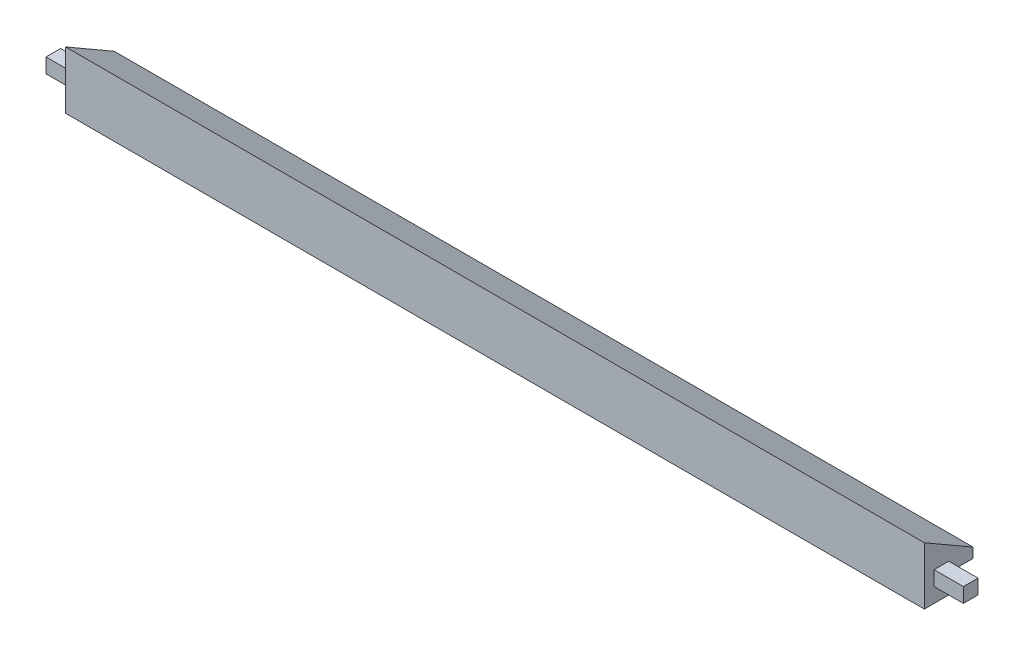
ISO-10303-21;
HEADER;
FILE_DESCRIPTION(('STEP AP214'),'2;1');
FILE_NAME('part.step','',(''),(''),'','','');
FILE_SCHEMA(('AUTOMOTIVE_DESIGN { 1 0 10303 214 1 1 1 1 }'));
ENDSEC;
DATA;
#1=APPLICATION_CONTEXT('core data for automotive mechanical design processes');
#2=APPLICATION_PROTOCOL_DEFINITION('international standard','automotive_design',2000,#1);
#3=PRODUCT_CONTEXT('',#1,'mechanical');
#4=PRODUCT('Part','Part','',(#3));
#5=PRODUCT_RELATED_PRODUCT_CATEGORY('part','',(#4));
#6=PRODUCT_DEFINITION_FORMATION('','',#4);
#7=PRODUCT_DEFINITION_CONTEXT('part definition',#1,'design');
#8=PRODUCT_DEFINITION('design','',#6,#7);
#9=PRODUCT_DEFINITION_SHAPE('','',#8);
#10=(LENGTH_UNIT() NAMED_UNIT(*) SI_UNIT(.MILLI.,.METRE.));
#11=(NAMED_UNIT(*) PLANE_ANGLE_UNIT() SI_UNIT($,.RADIAN.));
#12=(NAMED_UNIT(*) SI_UNIT($,.STERADIAN.) SOLID_ANGLE_UNIT());
#13=UNCERTAINTY_MEASURE_WITH_UNIT(LENGTH_MEASURE(1.E-05),#10,'distance_accuracy_value','');
#14=(GEOMETRIC_REPRESENTATION_CONTEXT(3) GLOBAL_UNCERTAINTY_ASSIGNED_CONTEXT((#13)) GLOBAL_UNIT_ASSIGNED_CONTEXT((#10,
#11,#12)) REPRESENTATION_CONTEXT('',''));
#15=CARTESIAN_POINT('',(0.,0.,0.));
#16=DIRECTION('',(0.,0.,1.));
#17=DIRECTION('',(1.,0.,0.));
#18=AXIS2_PLACEMENT_3D('',#15,#16,#17);
#19=CARTESIAN_POINT('',(88.,0.,0.));
#20=DIRECTION('',(-1.,0.,0.));
#21=DIRECTION('',(0.,0.,1.));
#22=AXIS2_PLACEMENT_3D('',#19,#20,#21);
#23=PLANE('',#22);
#24=DIRECTION('',(0.,1.,0.));
#25=VECTOR('',#24,1.);
#26=CARTESIAN_POINT('',(88.,-1.50730548165089,-1.59792234768979));
#27=LINE('',#26,#25);
#28=CARTESIAN_POINT('',(88.,-1.50730548165089,-1.59792234768979));
#29=VERTEX_POINT('',#28);
#30=CARTESIAN_POINT('',(88.,0.49269451834911,-1.59792234768979));
#31=VERTEX_POINT('',#30);
#32=EDGE_CURVE('E189',#29,#31,#27,.T.);
#33=ORIENTED_EDGE('',*,*,#32,.T.);
#34=DIRECTION('',(0.,0.,-1.));
#35=VECTOR('',#34,1.);
#36=CARTESIAN_POINT('',(88.,0.49269451834911,-3.59792234768979));
#37=LINE('',#36,#35);
#38=CARTESIAN_POINT('',(88.,0.49269451834911,-3.59792234768979));
#39=VERTEX_POINT('',#38);
#40=EDGE_CURVE('E192',#31,#39,#37,.T.);
#41=ORIENTED_EDGE('',*,*,#40,.T.);
#42=DIRECTION('',(0.,1.,0.));
#43=VECTOR('',#42,1.);
#44=CARTESIAN_POINT('',(88.,-1.50730548165089,-3.59792234768979));
#45=LINE('',#44,#43);
#46=CARTESIAN_POINT('',(88.,1.49269451834911,-3.59792234768979));
#47=VERTEX_POINT('',#46);
#48=EDGE_CURVE('E214',#39,#47,#45,.T.);
#49=ORIENTED_EDGE('',*,*,#48,.T.);
#50=DIRECTION('',(0.,0.500277482468682,0.865865139923532));
#51=VECTOR('',#50,1.);
#52=CARTESIAN_POINT('',(88.,4.38158251834911,1.40207765231021));
#53=LINE('',#52,#51);
#54=CARTESIAN_POINT('',(88.,4.38158251834911,1.40207765231021));
#55=VERTEX_POINT('',#54);
#56=EDGE_CURVE('E216',#47,#55,#53,.T.);
#57=ORIENTED_EDGE('',*,*,#56,.T.);
#58=DIRECTION('',(0.,-1.,0.));
#59=VECTOR('',#58,1.);
#60=CARTESIAN_POINT('',(88.,-1.50730548165089,1.40207765231021));
#61=LINE('',#60,#59);
#62=CARTESIAN_POINT('',(88.,-1.50730548165089,1.40207765231021));
#63=VERTEX_POINT('',#62);
#64=EDGE_CURVE('E207',#55,#63,#61,.T.);
#65=ORIENTED_EDGE('',*,*,#64,.T.);
#66=DIRECTION('',(0.,0.,-1.));
#67=VECTOR('',#66,1.);
#68=CARTESIAN_POINT('',(88.,-1.50730548165089,1.40207765231021));
#69=LINE('',#68,#67);
#70=EDGE_CURVE('E210',#63,#29,#69,.T.);
#71=ORIENTED_EDGE('',*,*,#70,.T.);
#72=EDGE_LOOP('',(#33,#41,#49,#57,#65,#71));
#73=FACE_BOUND('',#72,.T.);
#74=DIRECTION('',(0.,-1.,0.));
#75=VECTOR('',#74,1.);
#76=CARTESIAN_POINT('',(88.,-0.00730548165088973,0.402077652310209));
#77=LINE('',#76,#75);
#78=CARTESIAN_POINT('',(88.,1.49269451834911,0.402077652310209));
#79=VERTEX_POINT('',#78);
#80=CARTESIAN_POINT('',(88.,-0.00730548165088973,0.402077652310209));
#81=VERTEX_POINT('',#80);
#82=EDGE_CURVE('E153',#79,#81,#77,.T.);
#83=ORIENTED_EDGE('',*,*,#82,.F.);
#84=DIRECTION('',(0.,0.,1.));
#85=VECTOR('',#84,1.);
#86=CARTESIAN_POINT('',(88.,1.49269451834911,0.402077652310209));
#87=LINE('',#86,#85);
#88=CARTESIAN_POINT('',(88.,1.49269451834911,-1.09792234768979));
#89=VERTEX_POINT('',#88);
#90=EDGE_CURVE('E150',#89,#79,#87,.T.);
#91=ORIENTED_EDGE('',*,*,#90,.F.);
#92=DIRECTION('',(0.,1.,0.));
#93=VECTOR('',#92,1.);
#94=CARTESIAN_POINT('',(88.,-0.00730548165088973,-1.09792234768979));
#95=LINE('',#94,#93);
#96=CARTESIAN_POINT('',(88.,-0.00730548165088973,-1.09792234768979));
#97=VERTEX_POINT('',#96);
#98=EDGE_CURVE('E52',#97,#89,#95,.T.);
#99=ORIENTED_EDGE('',*,*,#98,.F.);
#100=DIRECTION('',(0.,0.,-1.));
#101=VECTOR('',#100,1.);
#102=CARTESIAN_POINT('',(88.,-0.00730548165088973,0.402077652310209));
#103=LINE('',#102,#101);
#104=EDGE_CURVE('E47',#81,#97,#103,.T.);
#105=ORIENTED_EDGE('',*,*,#104,.F.);
#106=EDGE_LOOP('',(#83,#91,#99,#105));
#107=FACE_BOUND('',#106,.T.);
#108=ADVANCED_FACE('F32',(#73,#107),#23,.F.);
#109=CARTESIAN_POINT('',(0.,0.,0.));
#110=DIRECTION('',(-1.,0.,0.));
#111=DIRECTION('',(0.,0.,1.));
#112=AXIS2_PLACEMENT_3D('',#109,#110,#111);
#113=PLANE('',#112);
#114=DIRECTION('',(0.,0.,-1.));
#115=VECTOR('',#114,1.);
#116=CARTESIAN_POINT('',(0.,0.49269451834911,-3.59792234768979));
#117=LINE('',#116,#115);
#118=CARTESIAN_POINT('',(0.,0.49269451834911,-1.59792234768979));
#119=VERTEX_POINT('',#118);
#120=CARTESIAN_POINT('',(0.,0.49269451834911,-3.59792234768979));
#121=VERTEX_POINT('',#120);
#122=EDGE_CURVE('E193',#119,#121,#117,.T.);
#123=ORIENTED_EDGE('',*,*,#122,.F.);
#124=DIRECTION('',(0.,1.,0.));
#125=VECTOR('',#124,1.);
#126=CARTESIAN_POINT('',(0.,-1.50730548165089,-1.59792234768979));
#127=LINE('',#126,#125);
#128=CARTESIAN_POINT('',(0.,-1.50730548165089,-1.59792234768979));
#129=VERTEX_POINT('',#128);
#130=EDGE_CURVE('E188',#129,#119,#127,.T.);
#131=ORIENTED_EDGE('',*,*,#130,.F.);
#132=DIRECTION('',(0.,0.,-1.));
#133=VECTOR('',#132,1.);
#134=CARTESIAN_POINT('',(0.,-1.50730548165089,1.40207765231021));
#135=LINE('',#134,#133);
#136=CARTESIAN_POINT('',(0.,-1.50730548165089,1.40207765231021));
#137=VERTEX_POINT('',#136);
#138=EDGE_CURVE('E221',#137,#129,#135,.T.);
#139=ORIENTED_EDGE('',*,*,#138,.F.);
#140=DIRECTION('',(0.,-1.,0.));
#141=VECTOR('',#140,1.);
#142=CARTESIAN_POINT('',(0.,-1.50730548165089,1.40207765231021));
#143=LINE('',#142,#141);
#144=CARTESIAN_POINT('',(0.,4.38158251834911,1.40207765231021));
#145=VERTEX_POINT('',#144);
#146=EDGE_CURVE('E203',#145,#137,#143,.T.);
#147=ORIENTED_EDGE('',*,*,#146,.F.);
#148=DIRECTION('',(0.,0.500277482468682,0.865865139923532));
#149=VECTOR('',#148,1.);
#150=CARTESIAN_POINT('',(0.,4.38158251834911,1.40207765231021));
#151=LINE('',#150,#149);
#152=CARTESIAN_POINT('',(0.,1.49269451834911,-3.59792234768979));
#153=VERTEX_POINT('',#152);
#154=EDGE_CURVE('E211',#153,#145,#151,.T.);
#155=ORIENTED_EDGE('',*,*,#154,.F.);
#156=DIRECTION('',(0.,1.,0.));
#157=VECTOR('',#156,1.);
#158=CARTESIAN_POINT('',(0.,-1.50730548165089,-3.59792234768979));
#159=LINE('',#158,#157);
#160=EDGE_CURVE('E224',#121,#153,#159,.T.);
#161=ORIENTED_EDGE('',*,*,#160,.F.);
#162=EDGE_LOOP('',(#123,#131,#139,#147,#155,#161));
#163=FACE_BOUND('',#162,.T.);
#164=DIRECTION('',(0.,0.,-1.));
#165=VECTOR('',#164,1.);
#166=CARTESIAN_POINT('',(0.,1.49269451834911,0.402077652310209));
#167=LINE('',#166,#165);
#168=CARTESIAN_POINT('',(0.,1.49269451834911,0.402077652310209));
#169=VERTEX_POINT('',#168);
#170=CARTESIAN_POINT('',(0.,1.49269451834911,-1.09792234768979));
#171=VERTEX_POINT('',#170);
#172=EDGE_CURVE('E157',#169,#171,#167,.T.);
#173=ORIENTED_EDGE('',*,*,#172,.F.);
#174=DIRECTION('',(0.,1.,0.));
#175=VECTOR('',#174,1.);
#176=CARTESIAN_POINT('',(0.,-0.00730548165088973,0.402077652310209));
#177=LINE('',#176,#175);
#178=CARTESIAN_POINT('',(0.,-0.00730548165088973,0.402077652310209));
#179=VERTEX_POINT('',#178);
#180=EDGE_CURVE('E154',#179,#169,#177,.T.);
#181=ORIENTED_EDGE('',*,*,#180,.F.);
#182=DIRECTION('',(0.,0.,1.));
#183=VECTOR('',#182,1.);
#184=CARTESIAN_POINT('',(0.,-0.00730548165088973,0.402077652310209));
#185=LINE('',#184,#183);
#186=CARTESIAN_POINT('',(0.,-0.00730548165088973,-1.09792234768979));
#187=VERTEX_POINT('',#186);
#188=EDGE_CURVE('E167',#187,#179,#185,.T.);
#189=ORIENTED_EDGE('',*,*,#188,.F.);
#190=DIRECTION('',(0.,-1.,0.));
#191=VECTOR('',#190,1.);
#192=CARTESIAN_POINT('',(0.,-0.00730548165088973,-1.09792234768979));
#193=LINE('',#192,#191);
#194=EDGE_CURVE('E175',#171,#187,#193,.T.);
#195=ORIENTED_EDGE('',*,*,#194,.F.);
#196=EDGE_LOOP('',(#173,#181,#189,#195));
#197=FACE_BOUND('',#196,.T.);
#198=ADVANCED_FACE('F241',(#163,#197),#113,.T.);
#199=CARTESIAN_POINT('',(88.,-1.50730548165089,1.40207765231021));
#200=DIRECTION('',(0.,0.,-1.));
#201=DIRECTION('',(-1.,0.,0.));
#202=AXIS2_PLACEMENT_3D('',#199,#200,#201);
#203=PLANE('',#202);
#204=ORIENTED_EDGE('',*,*,#146,.T.);
#205=DIRECTION('',(-1.,0.,0.));
#206=VECTOR('',#205,1.);
#207=CARTESIAN_POINT('',(88.,-1.50730548165089,1.40207765231021));
#208=LINE('',#207,#206);
#209=EDGE_CURVE('E11',#63,#137,#208,.T.);
#210=ORIENTED_EDGE('',*,*,#209,.F.);
#211=ORIENTED_EDGE('',*,*,#64,.F.);
#212=DIRECTION('',(-1.,0.,0.));
#213=VECTOR('',#212,1.);
#214=CARTESIAN_POINT('',(88.,4.38158251834911,1.40207765231021));
#215=LINE('',#214,#213);
#216=EDGE_CURVE('E218',#55,#145,#215,.T.);
#217=ORIENTED_EDGE('',*,*,#216,.T.);
#218=EDGE_LOOP('',(#204,#210,#211,#217));
#219=FACE_BOUND('',#218,.T.);
#220=ADVANCED_FACE('F34',(#219),#203,.F.);
#221=CARTESIAN_POINT('',(88.,-1.50730548165089,1.40207765231021));
#222=DIRECTION('',(0.,1.,0.));
#223=DIRECTION('',(0.,0.,1.));
#224=AXIS2_PLACEMENT_3D('',#221,#222,#223);
#225=PLANE('',#224);
#226=ORIENTED_EDGE('',*,*,#138,.T.);
#227=DIRECTION('',(-1.,0.,0.));
#228=VECTOR('',#227,1.);
#229=CARTESIAN_POINT('',(88.,-1.50730548165089,-1.59792234768979));
#230=LINE('',#229,#228);
#231=EDGE_CURVE('E196',#29,#129,#230,.T.);
#232=ORIENTED_EDGE('',*,*,#231,.F.);
#233=ORIENTED_EDGE('',*,*,#70,.F.);
#234=ORIENTED_EDGE('',*,*,#209,.T.);
#235=EDGE_LOOP('',(#226,#232,#233,#234));
#236=FACE_BOUND('',#235,.T.);
#237=ADVANCED_FACE('F255',(#236),#225,.F.);
#238=CARTESIAN_POINT('',(88.,-1.50730548165089,-3.59792234768979));
#239=DIRECTION('',(0.,0.,1.));
#240=DIRECTION('',(1.,0.,0.));
#241=AXIS2_PLACEMENT_3D('',#238,#239,#240);
#242=PLANE('',#241);
#243=ORIENTED_EDGE('',*,*,#48,.F.);
#244=DIRECTION('',(-1.,0.,0.));
#245=VECTOR('',#244,1.);
#246=CARTESIAN_POINT('',(88.,0.49269451834911,-3.59792234768979));
#247=LINE('',#246,#245);
#248=EDGE_CURVE('E200',#39,#121,#247,.T.);
#249=ORIENTED_EDGE('',*,*,#248,.T.);
#250=ORIENTED_EDGE('',*,*,#160,.T.);
#251=DIRECTION('',(-1.,0.,0.));
#252=VECTOR('',#251,1.);
#253=CARTESIAN_POINT('',(88.,1.49269451834911,-3.59792234768979));
#254=LINE('',#253,#252);
#255=EDGE_CURVE('E40',#47,#153,#254,.T.);
#256=ORIENTED_EDGE('',*,*,#255,.F.);
#257=EDGE_LOOP('',(#243,#249,#250,#256));
#258=FACE_BOUND('',#257,.T.);
#259=ADVANCED_FACE('F249',(#258),#242,.F.);
#260=CARTESIAN_POINT('',(88.,4.38158251834911,1.40207765231021));
#261=DIRECTION('',(0.,-0.865865139923532,0.500277482468682));
#262=DIRECTION('',(0.,-0.500277482468682,-0.865865139923532));
#263=AXIS2_PLACEMENT_3D('',#260,#261,#262);
#264=PLANE('',#263);
#265=ORIENTED_EDGE('',*,*,#154,.T.);
#266=ORIENTED_EDGE('',*,*,#216,.F.);
#267=ORIENTED_EDGE('',*,*,#56,.F.);
#268=ORIENTED_EDGE('',*,*,#255,.T.);
#269=EDGE_LOOP('',(#265,#266,#267,#268));
#270=FACE_BOUND('',#269,.T.);
#271=ADVANCED_FACE('F233',(#270),#264,.F.);
#272=CARTESIAN_POINT('',(88.,0.49269451834911,-3.59792234768979));
#273=DIRECTION('',(0.,1.,0.));
#274=DIRECTION('',(0.,0.,1.));
#275=AXIS2_PLACEMENT_3D('',#272,#273,#274);
#276=PLANE('',#275);
#277=ORIENTED_EDGE('',*,*,#122,.T.);
#278=ORIENTED_EDGE('',*,*,#248,.F.);
#279=ORIENTED_EDGE('',*,*,#40,.F.);
#280=DIRECTION('',(-1.,0.,0.));
#281=VECTOR('',#280,1.);
#282=CARTESIAN_POINT('',(88.,0.49269451834911,-1.59792234768979));
#283=LINE('',#282,#281);
#284=EDGE_CURVE('E204',#31,#119,#283,.T.);
#285=ORIENTED_EDGE('',*,*,#284,.T.);
#286=EDGE_LOOP('',(#277,#278,#279,#285));
#287=FACE_BOUND('',#286,.T.);
#288=ADVANCED_FACE('F251',(#287),#276,.F.);
#289=CARTESIAN_POINT('',(88.,-1.50730548165089,-1.59792234768979));
#290=DIRECTION('',(0.,0.,1.));
#291=DIRECTION('',(1.,0.,0.));
#292=AXIS2_PLACEMENT_3D('',#289,#290,#291);
#293=PLANE('',#292);
#294=ORIENTED_EDGE('',*,*,#130,.T.);
#295=ORIENTED_EDGE('',*,*,#284,.F.);
#296=ORIENTED_EDGE('',*,*,#32,.F.);
#297=ORIENTED_EDGE('',*,*,#231,.T.);
#298=EDGE_LOOP('',(#294,#295,#296,#297));
#299=FACE_BOUND('',#298,.T.);
#300=ADVANCED_FACE('F256',(#299),#293,.F.);
#301=CARTESIAN_POINT('',(-3.,-0.00730548165088973,0.402077652310209));
#302=DIRECTION('',(0.,0.,-1.));
#303=DIRECTION('',(-1.,0.,0.));
#304=AXIS2_PLACEMENT_3D('',#301,#302,#303);
#305=PLANE('',#304);
#306=ORIENTED_EDGE('',*,*,#180,.T.);
#307=DIRECTION('',(1.,0.,0.));
#308=VECTOR('',#307,1.);
#309=CARTESIAN_POINT('',(-3.,1.49269451834911,0.402077652310209));
#310=LINE('',#309,#308);
#311=CARTESIAN_POINT('',(-3.,1.49269451834911,0.402077652310209));
#312=VERTEX_POINT('',#311);
#313=EDGE_CURVE('E186',#312,#169,#310,.T.);
#314=ORIENTED_EDGE('',*,*,#313,.F.);
#315=DIRECTION('',(0.,1.,0.));
#316=VECTOR('',#315,1.);
#317=CARTESIAN_POINT('',(-3.,-0.00730548165088973,0.402077652310209));
#318=LINE('',#317,#316);
#319=CARTESIAN_POINT('',(-3.,-0.00730548165088973,0.402077652310209));
#320=VERTEX_POINT('',#319);
#321=EDGE_CURVE('E163',#320,#312,#318,.T.);
#322=ORIENTED_EDGE('',*,*,#321,.F.);
#323=DIRECTION('',(1.,0.,0.));
#324=VECTOR('',#323,1.);
#325=CARTESIAN_POINT('',(-3.,-0.00730548165088973,0.402077652310209));
#326=LINE('',#325,#324);
#327=EDGE_CURVE('E172',#320,#179,#326,.T.);
#328=ORIENTED_EDGE('',*,*,#327,.T.);
#329=EDGE_LOOP('',(#306,#314,#322,#328));
#330=FACE_BOUND('',#329,.T.);
#331=ADVANCED_FACE('F258',(#330),#305,.F.);
#332=CARTESIAN_POINT('',(-3.,1.49269451834911,0.402077652310209));
#333=DIRECTION('',(0.,-1.,0.));
#334=DIRECTION('',(0.,0.,-1.));
#335=AXIS2_PLACEMENT_3D('',#332,#333,#334);
#336=PLANE('',#335);
#337=ORIENTED_EDGE('',*,*,#172,.T.);
#338=DIRECTION('',(1.,0.,0.));
#339=VECTOR('',#338,1.);
#340=CARTESIAN_POINT('',(-3.,1.49269451834911,-1.09792234768979));
#341=LINE('',#340,#339);
#342=CARTESIAN_POINT('',(-3.,1.49269451834911,-1.09792234768979));
#343=VERTEX_POINT('',#342);
#344=EDGE_CURVE('E183',#343,#171,#341,.T.);
#345=ORIENTED_EDGE('',*,*,#344,.F.);
#346=DIRECTION('',(0.,0.,-1.));
#347=VECTOR('',#346,1.);
#348=CARTESIAN_POINT('',(-3.,1.49269451834911,0.402077652310209));
#349=LINE('',#348,#347);
#350=EDGE_CURVE('E166',#312,#343,#349,.T.);
#351=ORIENTED_EDGE('',*,*,#350,.F.);
#352=ORIENTED_EDGE('',*,*,#313,.T.);
#353=EDGE_LOOP('',(#337,#345,#351,#352));
#354=FACE_BOUND('',#353,.T.);
#355=ADVANCED_FACE('F264',(#354),#336,.F.);
#356=CARTESIAN_POINT('',(-3.,-0.00730548165088973,-1.09792234768979));
#357=DIRECTION('',(0.,0.,1.));
#358=DIRECTION('',(1.,0.,0.));
#359=AXIS2_PLACEMENT_3D('',#356,#357,#358);
#360=PLANE('',#359);
#361=ORIENTED_EDGE('',*,*,#194,.T.);
#362=DIRECTION('',(1.,0.,0.));
#363=VECTOR('',#362,1.);
#364=CARTESIAN_POINT('',(-3.,-0.00730548165088973,-1.09792234768979));
#365=LINE('',#364,#363);
#366=CARTESIAN_POINT('',(-3.,-0.00730548165088973,-1.09792234768979));
#367=VERTEX_POINT('',#366);
#368=EDGE_CURVE('E181',#367,#187,#365,.T.);
#369=ORIENTED_EDGE('',*,*,#368,.F.);
#370=DIRECTION('',(0.,-1.,0.));
#371=VECTOR('',#370,1.);
#372=CARTESIAN_POINT('',(-3.,-0.00730548165088973,-1.09792234768979));
#373=LINE('',#372,#371);
#374=EDGE_CURVE('E169',#343,#367,#373,.T.);
#375=ORIENTED_EDGE('',*,*,#374,.F.);
#376=ORIENTED_EDGE('',*,*,#344,.T.);
#377=EDGE_LOOP('',(#361,#369,#375,#376));
#378=FACE_BOUND('',#377,.T.);
#379=ADVANCED_FACE('F307',(#378),#360,.F.);
#380=CARTESIAN_POINT('',(-3.,-0.00730548165088973,0.402077652310209));
#381=DIRECTION('',(0.,1.,0.));
#382=DIRECTION('',(0.,0.,1.));
#383=AXIS2_PLACEMENT_3D('',#380,#381,#382);
#384=PLANE('',#383);
#385=ORIENTED_EDGE('',*,*,#188,.T.);
#386=ORIENTED_EDGE('',*,*,#327,.F.);
#387=DIRECTION('',(0.,0.,1.));
#388=VECTOR('',#387,1.);
#389=CARTESIAN_POINT('',(-3.,-0.00730548165088973,0.402077652310209));
#390=LINE('',#389,#388);
#391=EDGE_CURVE('E171',#367,#320,#390,.T.);
#392=ORIENTED_EDGE('',*,*,#391,.F.);
#393=ORIENTED_EDGE('',*,*,#368,.T.);
#394=EDGE_LOOP('',(#385,#386,#392,#393));
#395=FACE_BOUND('',#394,.T.);
#396=ADVANCED_FACE('F317',(#395),#384,.F.);
#397=CARTESIAN_POINT('',(-3.,0.,0.));
#398=DIRECTION('',(-1.,0.,0.));
#399=DIRECTION('',(0.,0.,1.));
#400=AXIS2_PLACEMENT_3D('',#397,#398,#399);
#401=PLANE('',#400);
#402=ORIENTED_EDGE('',*,*,#321,.T.);
#403=ORIENTED_EDGE('',*,*,#350,.T.);
#404=ORIENTED_EDGE('',*,*,#374,.T.);
#405=ORIENTED_EDGE('',*,*,#391,.T.);
#406=EDGE_LOOP('',(#402,#403,#404,#405));
#407=FACE_BOUND('',#406,.T.);
#408=ADVANCED_FACE('F327',(#407),#401,.T.);
#409=CARTESIAN_POINT('',(91.,-0.00730548165088973,0.402077652310209));
#410=DIRECTION('',(0.,0.,-1.));
#411=DIRECTION('',(-1.,0.,0.));
#412=AXIS2_PLACEMENT_3D('',#409,#410,#411);
#413=PLANE('',#412);
#414=ORIENTED_EDGE('',*,*,#82,.T.);
#415=DIRECTION('',(-1.,0.,0.));
#416=VECTOR('',#415,1.);
#417=CARTESIAN_POINT('',(91.,-0.00730548165088973,0.402077652310209));
#418=LINE('',#417,#416);
#419=CARTESIAN_POINT('',(91.,-0.00730548165088973,0.402077652310209));
#420=VERTEX_POINT('',#419);
#421=EDGE_CURVE('E134',#420,#81,#418,.T.);
#422=ORIENTED_EDGE('',*,*,#421,.F.);
#423=DIRECTION('',(0.,-1.,0.));
#424=VECTOR('',#423,1.);
#425=CARTESIAN_POINT('',(91.,-0.00730548165088973,0.402077652310209));
#426=LINE('',#425,#424);
#427=CARTESIAN_POINT('',(91.,1.49269451834911,0.402077652310209));
#428=VERTEX_POINT('',#427);
#429=EDGE_CURVE('E141',#428,#420,#426,.T.);
#430=ORIENTED_EDGE('',*,*,#429,.F.);
#431=DIRECTION('',(-1.,0.,0.));
#432=VECTOR('',#431,1.);
#433=CARTESIAN_POINT('',(91.,1.49269451834911,0.402077652310209));
#434=LINE('',#433,#432);
#435=EDGE_CURVE('E391',#428,#79,#434,.T.);
#436=ORIENTED_EDGE('',*,*,#435,.T.);
#437=EDGE_LOOP('',(#414,#422,#430,#436));
#438=FACE_BOUND('',#437,.T.);
#439=ADVANCED_FACE('F152',(#438),#413,.F.);
#440=CARTESIAN_POINT('',(91.,-0.00730548165088973,0.402077652310209));
#441=DIRECTION('',(0.,1.,0.));
#442=DIRECTION('',(0.,0.,1.));
#443=AXIS2_PLACEMENT_3D('',#440,#441,#442);
#444=PLANE('',#443);
#445=ORIENTED_EDGE('',*,*,#104,.T.);
#446=DIRECTION('',(-1.,0.,0.));
#447=VECTOR('',#446,1.);
#448=CARTESIAN_POINT('',(91.,-0.00730548165088973,-1.09792234768979));
#449=LINE('',#448,#447);
#450=CARTESIAN_POINT('',(91.,-0.00730548165088973,-1.09792234768979));
#451=VERTEX_POINT('',#450);
#452=EDGE_CURVE('E137',#451,#97,#449,.T.);
#453=ORIENTED_EDGE('',*,*,#452,.F.);
#454=DIRECTION('',(0.,0.,-1.));
#455=VECTOR('',#454,1.);
#456=CARTESIAN_POINT('',(91.,-0.00730548165088973,0.402077652310209));
#457=LINE('',#456,#455);
#458=EDGE_CURVE('E130',#420,#451,#457,.T.);
#459=ORIENTED_EDGE('',*,*,#458,.F.);
#460=ORIENTED_EDGE('',*,*,#421,.T.);
#461=EDGE_LOOP('',(#445,#453,#459,#460));
#462=FACE_BOUND('',#461,.T.);
#463=ADVANCED_FACE('F132',(#462),#444,.F.);
#464=CARTESIAN_POINT('',(91.,-0.00730548165088973,-1.09792234768979));
#465=DIRECTION('',(0.,0.,1.));
#466=DIRECTION('',(1.,0.,0.));
#467=AXIS2_PLACEMENT_3D('',#464,#465,#466);
#468=PLANE('',#467);
#469=ORIENTED_EDGE('',*,*,#98,.T.);
#470=DIRECTION('',(-1.,0.,0.));
#471=VECTOR('',#470,1.);
#472=CARTESIAN_POINT('',(91.,1.49269451834911,-1.09792234768979));
#473=LINE('',#472,#471);
#474=CARTESIAN_POINT('',(91.,1.49269451834911,-1.09792234768979));
#475=VERTEX_POINT('',#474);
#476=EDGE_CURVE('E159',#475,#89,#473,.T.);
#477=ORIENTED_EDGE('',*,*,#476,.F.);
#478=DIRECTION('',(0.,1.,0.));
#479=VECTOR('',#478,1.);
#480=CARTESIAN_POINT('',(91.,-0.00730548165088973,-1.09792234768979));
#481=LINE('',#480,#479);
#482=EDGE_CURVE('E140',#451,#475,#481,.T.);
#483=ORIENTED_EDGE('',*,*,#482,.F.);
#484=ORIENTED_EDGE('',*,*,#452,.T.);
#485=EDGE_LOOP('',(#469,#477,#483,#484));
#486=FACE_BOUND('',#485,.T.);
#487=ADVANCED_FACE('F358',(#486),#468,.F.);
#488=CARTESIAN_POINT('',(91.,1.49269451834911,0.402077652310209));
#489=DIRECTION('',(0.,-1.,0.));
#490=DIRECTION('',(0.,0.,-1.));
#491=AXIS2_PLACEMENT_3D('',#488,#489,#490);
#492=PLANE('',#491);
#493=ORIENTED_EDGE('',*,*,#90,.T.);
#494=ORIENTED_EDGE('',*,*,#435,.F.);
#495=DIRECTION('',(0.,0.,1.));
#496=VECTOR('',#495,1.);
#497=CARTESIAN_POINT('',(91.,1.49269451834911,0.402077652310209));
#498=LINE('',#497,#496);
#499=EDGE_CURVE('E146',#475,#428,#498,.T.);
#500=ORIENTED_EDGE('',*,*,#499,.F.);
#501=ORIENTED_EDGE('',*,*,#476,.T.);
#502=EDGE_LOOP('',(#493,#494,#500,#501));
#503=FACE_BOUND('',#502,.T.);
#504=ADVANCED_FACE('F367',(#503),#492,.F.);
#505=CARTESIAN_POINT('',(91.,0.,0.));
#506=DIRECTION('',(-1.,0.,0.));
#507=DIRECTION('',(0.,0.,1.));
#508=AXIS2_PLACEMENT_3D('',#505,#506,#507);
#509=PLANE('',#508);
#510=ORIENTED_EDGE('',*,*,#429,.T.);
#511=ORIENTED_EDGE('',*,*,#458,.T.);
#512=ORIENTED_EDGE('',*,*,#482,.T.);
#513=ORIENTED_EDGE('',*,*,#499,.T.);
#514=EDGE_LOOP('',(#510,#511,#512,#513));
#515=FACE_BOUND('',#514,.T.);
#516=ADVANCED_FACE('F144',(#515),#509,.F.);
#517=CLOSED_SHELL('',(#108,#198,#220,#237,#259,#271,#288,#300,#331,#355,#379,#396,#408,#439,
#463,#487,#504,#516));
#518=MANIFOLD_SOLID_BREP('B2',#517);
#519=ADVANCED_BREP_SHAPE_REPRESENTATION('',(#18,#518),#14);
#520=SHAPE_DEFINITION_REPRESENTATION(#9,#519);
ENDSEC;
END-ISO-10303-21;
